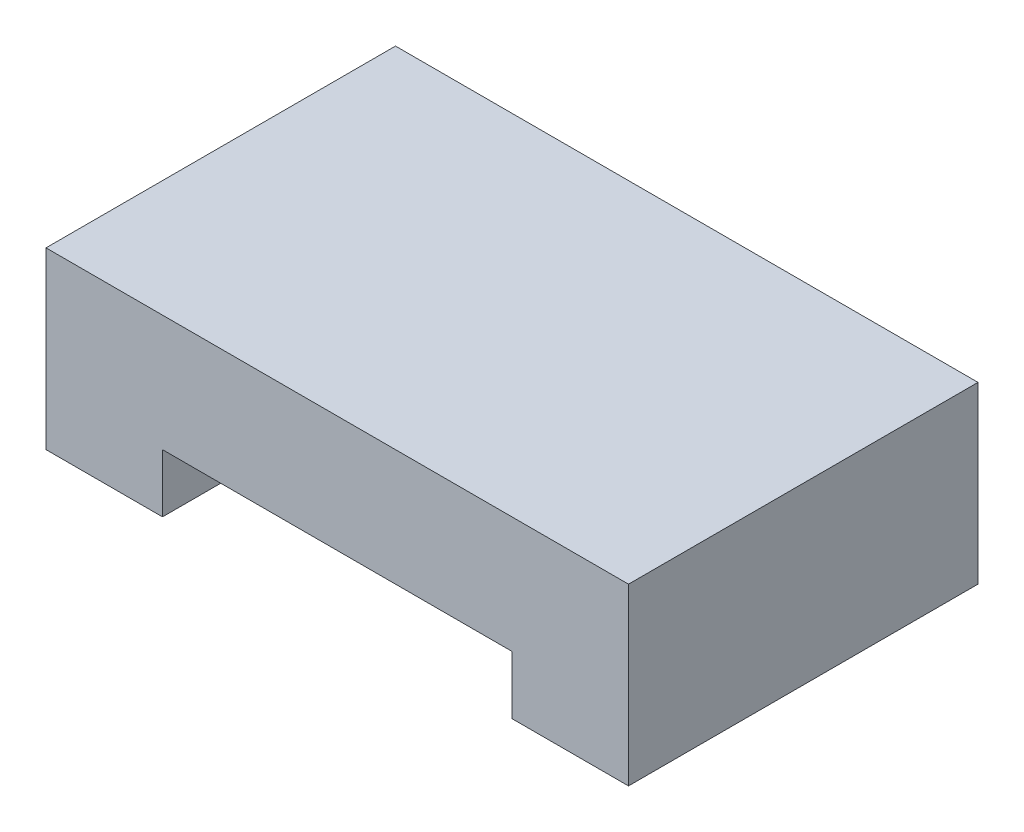
ISO-10303-21;
HEADER;
FILE_DESCRIPTION(('STEP AP214'),'2;1');
FILE_NAME('part.step','',(''),(''),'','','');
FILE_SCHEMA(('AUTOMOTIVE_DESIGN { 1 0 10303 214 1 1 1 1 }'));
ENDSEC;
DATA;
#1=APPLICATION_CONTEXT('core data for automotive mechanical design processes');
#2=APPLICATION_PROTOCOL_DEFINITION('international standard','automotive_design',2000,#1);
#3=PRODUCT_CONTEXT('',#1,'mechanical');
#4=PRODUCT('Part','Part','',(#3));
#5=PRODUCT_RELATED_PRODUCT_CATEGORY('part','',(#4));
#6=PRODUCT_DEFINITION_FORMATION('','',#4);
#7=PRODUCT_DEFINITION_CONTEXT('part definition',#1,'design');
#8=PRODUCT_DEFINITION('design','',#6,#7);
#9=PRODUCT_DEFINITION_SHAPE('','',#8);
#10=(LENGTH_UNIT() NAMED_UNIT(*) SI_UNIT(.MILLI.,.METRE.));
#11=(NAMED_UNIT(*) PLANE_ANGLE_UNIT() SI_UNIT($,.RADIAN.));
#12=(NAMED_UNIT(*) SI_UNIT($,.STERADIAN.) SOLID_ANGLE_UNIT());
#13=UNCERTAINTY_MEASURE_WITH_UNIT(LENGTH_MEASURE(1.E-05),#10,'distance_accuracy_value','');
#14=(GEOMETRIC_REPRESENTATION_CONTEXT(3) GLOBAL_UNCERTAINTY_ASSIGNED_CONTEXT((#13)) GLOBAL_UNIT_ASSIGNED_CONTEXT((#10,
#11,#12)) REPRESENTATION_CONTEXT('',''));
#15=CARTESIAN_POINT('',(0.,0.,0.));
#16=DIRECTION('',(0.,0.,1.));
#17=DIRECTION('',(1.,0.,0.));
#18=AXIS2_PLACEMENT_3D('',#15,#16,#17);
#19=CARTESIAN_POINT('',(0.,0.,0.));
#20=DIRECTION('',(0.,-1.,0.));
#21=DIRECTION('',(0.,0.,-1.));
#22=AXIS2_PLACEMENT_3D('',#19,#20,#21);
#23=PLANE('',#22);
#24=DIRECTION('',(-1.,0.,0.));
#25=VECTOR('',#24,1.);
#26=CARTESIAN_POINT('',(-2.5,0.,-1.5));
#27=LINE('',#26,#25);
#28=CARTESIAN_POINT('',(1.5,0.,-1.5));
#29=VERTEX_POINT('',#28);
#30=CARTESIAN_POINT('',(-1.5,0.,-1.5));
#31=VERTEX_POINT('',#30);
#32=EDGE_CURVE('E171',#29,#31,#27,.T.);
#33=ORIENTED_EDGE('',*,*,#32,.F.);
#34=DIRECTION('',(0.,0.,-1.));
#35=VECTOR('',#34,1.);
#36=CARTESIAN_POINT('',(1.5,0.,1.5));
#37=LINE('',#36,#35);
#38=CARTESIAN_POINT('',(1.5,0.,1.5));
#39=VERTEX_POINT('',#38);
#40=EDGE_CURVE('E112',#39,#29,#37,.T.);
#41=ORIENTED_EDGE('',*,*,#40,.F.);
#42=DIRECTION('',(1.,0.,0.));
#43=VECTOR('',#42,1.);
#44=CARTESIAN_POINT('',(-2.5,0.,1.5));
#45=LINE('',#44,#43);
#46=CARTESIAN_POINT('',(-1.5,0.,1.5));
#47=VERTEX_POINT('',#46);
#48=EDGE_CURVE('E166',#47,#39,#45,.T.);
#49=ORIENTED_EDGE('',*,*,#48,.F.);
#50=DIRECTION('',(0.,0.,1.));
#51=VECTOR('',#50,1.);
#52=CARTESIAN_POINT('',(-1.5,0.,1.5));
#53=LINE('',#52,#51);
#54=EDGE_CURVE('E197',#31,#47,#53,.T.);
#55=ORIENTED_EDGE('',*,*,#54,.F.);
#56=EDGE_LOOP('',(#33,#41,#49,#55));
#57=FACE_BOUND('',#56,.T.);
#58=ADVANCED_FACE('F39',(#57),#23,.T.);
#59=CARTESIAN_POINT('',(2.5,1.,1.5));
#60=DIRECTION('',(-1.,0.,0.));
#61=DIRECTION('',(0.,0.,1.));
#62=AXIS2_PLACEMENT_3D('',#59,#60,#61);
#63=PLANE('',#62);
#64=DIRECTION('',(0.,-1.,0.));
#65=VECTOR('',#64,1.);
#66=CARTESIAN_POINT('',(2.5,1.,1.5));
#67=LINE('',#66,#65);
#68=CARTESIAN_POINT('',(2.5,1.,1.5));
#69=VERTEX_POINT('',#68);
#70=CARTESIAN_POINT('',(2.5,-0.5,1.5));
#71=VERTEX_POINT('',#70);
#72=EDGE_CURVE('E162',#69,#71,#67,.T.);
#73=ORIENTED_EDGE('',*,*,#72,.T.);
#74=DIRECTION('',(0.,0.,-1.));
#75=VECTOR('',#74,1.);
#76=CARTESIAN_POINT('',(2.5,-0.5,1.5));
#77=LINE('',#76,#75);
#78=CARTESIAN_POINT('',(2.5,-0.5,-1.5));
#79=VERTEX_POINT('',#78);
#80=EDGE_CURVE('E130',#71,#79,#77,.T.);
#81=ORIENTED_EDGE('',*,*,#80,.T.);
#82=DIRECTION('',(0.,-1.,0.));
#83=VECTOR('',#82,1.);
#84=CARTESIAN_POINT('',(2.5,1.,-1.5));
#85=LINE('',#84,#83);
#86=CARTESIAN_POINT('',(2.5,1.,-1.5));
#87=VERTEX_POINT('',#86);
#88=EDGE_CURVE('E150',#87,#79,#85,.T.);
#89=ORIENTED_EDGE('',*,*,#88,.F.);
#90=DIRECTION('',(0.,0.,-1.));
#91=VECTOR('',#90,1.);
#92=CARTESIAN_POINT('',(2.5,1.,1.5));
#93=LINE('',#92,#91);
#94=EDGE_CURVE('E170',#69,#87,#93,.T.);
#95=ORIENTED_EDGE('',*,*,#94,.F.);
#96=EDGE_LOOP('',(#73,#81,#89,#95));
#97=FACE_BOUND('',#96,.T.);
#98=ADVANCED_FACE('F289',(#97),#63,.F.);
#99=CARTESIAN_POINT('',(-2.5,1.,-1.5));
#100=DIRECTION('',(0.,0.,1.));
#101=DIRECTION('',(1.,0.,0.));
#102=AXIS2_PLACEMENT_3D('',#99,#100,#101);
#103=PLANE('',#102);
#104=ORIENTED_EDGE('',*,*,#88,.T.);
#105=DIRECTION('',(-1.,0.,0.));
#106=VECTOR('',#105,1.);
#107=CARTESIAN_POINT('',(-2.5,-0.5,-1.5));
#108=LINE('',#107,#106);
#109=CARTESIAN_POINT('',(1.5,-0.5,-1.5));
#110=VERTEX_POINT('',#109);
#111=EDGE_CURVE('E144',#79,#110,#108,.T.);
#112=ORIENTED_EDGE('',*,*,#111,.T.);
#113=DIRECTION('',(0.,1.,0.));
#114=VECTOR('',#113,1.);
#115=CARTESIAN_POINT('',(1.5,-1.,-1.5));
#116=LINE('',#115,#114);
#117=EDGE_CURVE('E205',#110,#29,#116,.T.);
#118=ORIENTED_EDGE('',*,*,#117,.T.);
#119=ORIENTED_EDGE('',*,*,#32,.T.);
#120=DIRECTION('',(0.,1.,0.));
#121=VECTOR('',#120,1.);
#122=CARTESIAN_POINT('',(-1.5,-1.,-1.5));
#123=LINE('',#122,#121);
#124=CARTESIAN_POINT('',(-1.5,-0.5,-1.5));
#125=VERTEX_POINT('',#124);
#126=EDGE_CURVE('E175',#125,#31,#123,.T.);
#127=ORIENTED_EDGE('',*,*,#126,.F.);
#128=DIRECTION('',(-1.,0.,0.));
#129=VECTOR('',#128,1.);
#130=CARTESIAN_POINT('',(-2.5,-0.5,-1.5));
#131=LINE('',#130,#129);
#132=CARTESIAN_POINT('',(-2.5,-0.5,-1.5));
#133=VERTEX_POINT('',#132);
#134=EDGE_CURVE('E90',#125,#133,#131,.T.);
#135=ORIENTED_EDGE('',*,*,#134,.T.);
#136=DIRECTION('',(0.,-1.,0.));
#137=VECTOR('',#136,1.);
#138=CARTESIAN_POINT('',(-2.5,1.,-1.5));
#139=LINE('',#138,#137);
#140=CARTESIAN_POINT('',(-2.5,1.,-1.5));
#141=VERTEX_POINT('',#140);
#142=EDGE_CURVE('E154',#141,#133,#139,.T.);
#143=ORIENTED_EDGE('',*,*,#142,.F.);
#144=DIRECTION('',(-1.,0.,0.));
#145=VECTOR('',#144,1.);
#146=CARTESIAN_POINT('',(-2.5,1.,-1.5));
#147=LINE('',#146,#145);
#148=EDGE_CURVE('E183',#87,#141,#147,.T.);
#149=ORIENTED_EDGE('',*,*,#148,.F.);
#150=EDGE_LOOP('',(#104,#112,#118,#119,#127,#135,#143,#149));
#151=FACE_BOUND('',#150,.T.);
#152=ADVANCED_FACE('F226',(#151),#103,.F.);
#153=CARTESIAN_POINT('',(-2.5,1.,1.5));
#154=DIRECTION('',(1.,0.,0.));
#155=DIRECTION('',(0.,0.,-1.));
#156=AXIS2_PLACEMENT_3D('',#153,#154,#155);
#157=PLANE('',#156);
#158=ORIENTED_EDGE('',*,*,#142,.T.);
#159=DIRECTION('',(0.,0.,1.));
#160=VECTOR('',#159,1.);
#161=CARTESIAN_POINT('',(-2.5,-0.5,1.5));
#162=LINE('',#161,#160);
#163=CARTESIAN_POINT('',(-2.5,-0.5,1.5));
#164=VERTEX_POINT('',#163);
#165=EDGE_CURVE('E11',#133,#164,#162,.T.);
#166=ORIENTED_EDGE('',*,*,#165,.T.);
#167=DIRECTION('',(0.,-1.,0.));
#168=VECTOR('',#167,1.);
#169=CARTESIAN_POINT('',(-2.5,1.,1.5));
#170=LINE('',#169,#168);
#171=CARTESIAN_POINT('',(-2.5,1.,1.5));
#172=VERTEX_POINT('',#171);
#173=EDGE_CURVE('E158',#172,#164,#170,.T.);
#174=ORIENTED_EDGE('',*,*,#173,.F.);
#175=DIRECTION('',(0.,0.,1.));
#176=VECTOR('',#175,1.);
#177=CARTESIAN_POINT('',(-2.5,1.,1.5));
#178=LINE('',#177,#176);
#179=EDGE_CURVE('E179',#141,#172,#178,.T.);
#180=ORIENTED_EDGE('',*,*,#179,.F.);
#181=EDGE_LOOP('',(#158,#166,#174,#180));
#182=FACE_BOUND('',#181,.T.);
#183=ADVANCED_FACE('F241',(#182),#157,.F.);
#184=CARTESIAN_POINT('',(-2.5,1.,1.5));
#185=DIRECTION('',(0.,0.,-1.));
#186=DIRECTION('',(-1.,0.,0.));
#187=AXIS2_PLACEMENT_3D('',#184,#185,#186);
#188=PLANE('',#187);
#189=DIRECTION('',(0.,1.,0.));
#190=VECTOR('',#189,1.);
#191=CARTESIAN_POINT('',(1.5,-1.,1.5));
#192=LINE('',#191,#190);
#193=CARTESIAN_POINT('',(1.5,-0.5,1.5));
#194=VERTEX_POINT('',#193);
#195=EDGE_CURVE('E201',#194,#39,#192,.T.);
#196=ORIENTED_EDGE('',*,*,#195,.F.);
#197=DIRECTION('',(1.,0.,0.));
#198=VECTOR('',#197,1.);
#199=CARTESIAN_POINT('',(-2.5,-0.5,1.5));
#200=LINE('',#199,#198);
#201=EDGE_CURVE('E59',#194,#71,#200,.T.);
#202=ORIENTED_EDGE('',*,*,#201,.T.);
#203=ORIENTED_EDGE('',*,*,#72,.F.);
#204=DIRECTION('',(1.,0.,0.));
#205=VECTOR('',#204,1.);
#206=CARTESIAN_POINT('',(-2.5,1.,1.5));
#207=LINE('',#206,#205);
#208=EDGE_CURVE('E165',#172,#69,#207,.T.);
#209=ORIENTED_EDGE('',*,*,#208,.F.);
#210=ORIENTED_EDGE('',*,*,#173,.T.);
#211=DIRECTION('',(1.,0.,0.));
#212=VECTOR('',#211,1.);
#213=CARTESIAN_POINT('',(-1.5,-0.5,1.5));
#214=LINE('',#213,#212);
#215=CARTESIAN_POINT('',(-1.5,-0.5,1.5));
#216=VERTEX_POINT('',#215);
#217=EDGE_CURVE('E136',#164,#216,#214,.T.);
#218=ORIENTED_EDGE('',*,*,#217,.T.);
#219=DIRECTION('',(0.,1.,0.));
#220=VECTOR('',#219,1.);
#221=CARTESIAN_POINT('',(-1.5,-1.,1.5));
#222=LINE('',#221,#220);
#223=EDGE_CURVE('E193',#216,#47,#222,.T.);
#224=ORIENTED_EDGE('',*,*,#223,.T.);
#225=ORIENTED_EDGE('',*,*,#48,.T.);
#226=EDGE_LOOP('',(#196,#202,#203,#209,#210,#218,#224,#225));
#227=FACE_BOUND('',#226,.T.);
#228=ADVANCED_FACE('F246',(#227),#188,.F.);
#229=CARTESIAN_POINT('',(0.,1.,0.));
#230=DIRECTION('',(0.,-1.,0.));
#231=DIRECTION('',(0.,0.,-1.));
#232=AXIS2_PLACEMENT_3D('',#229,#230,#231);
#233=PLANE('',#232);
#234=ORIENTED_EDGE('',*,*,#94,.T.);
#235=ORIENTED_EDGE('',*,*,#148,.T.);
#236=ORIENTED_EDGE('',*,*,#179,.T.);
#237=ORIENTED_EDGE('',*,*,#208,.T.);
#238=EDGE_LOOP('',(#234,#235,#236,#237));
#239=FACE_BOUND('',#238,.T.);
#240=ADVANCED_FACE('F260',(#239),#233,.F.);
#241=CARTESIAN_POINT('',(-1.5,-1.,1.5));
#242=DIRECTION('',(-1.,0.,0.));
#243=DIRECTION('',(0.,0.,1.));
#244=AXIS2_PLACEMENT_3D('',#241,#242,#243);
#245=PLANE('',#244);
#246=ORIENTED_EDGE('',*,*,#223,.F.);
#247=DIRECTION('',(0.,0.,-1.));
#248=VECTOR('',#247,1.);
#249=CARTESIAN_POINT('',(-1.5,-0.5,-1.5));
#250=LINE('',#249,#248);
#251=EDGE_CURVE('E50',#216,#125,#250,.T.);
#252=ORIENTED_EDGE('',*,*,#251,.T.);
#253=ORIENTED_EDGE('',*,*,#126,.T.);
#254=ORIENTED_EDGE('',*,*,#54,.T.);
#255=EDGE_LOOP('',(#246,#252,#253,#254));
#256=FACE_BOUND('',#255,.T.);
#257=ADVANCED_FACE('F250',(#256),#245,.F.);
#258=CARTESIAN_POINT('',(1.5,-1.,1.5));
#259=DIRECTION('',(1.,0.,0.));
#260=DIRECTION('',(0.,0.,-1.));
#261=AXIS2_PLACEMENT_3D('',#258,#259,#260);
#262=PLANE('',#261);
#263=ORIENTED_EDGE('',*,*,#117,.F.);
#264=DIRECTION('',(0.,0.,1.));
#265=VECTOR('',#264,1.);
#266=CARTESIAN_POINT('',(1.5,-0.5,1.5));
#267=LINE('',#266,#265);
#268=EDGE_CURVE('E140',#110,#194,#267,.T.);
#269=ORIENTED_EDGE('',*,*,#268,.T.);
#270=ORIENTED_EDGE('',*,*,#195,.T.);
#271=ORIENTED_EDGE('',*,*,#40,.T.);
#272=EDGE_LOOP('',(#263,#269,#270,#271));
#273=FACE_BOUND('',#272,.T.);
#274=ADVANCED_FACE('F216',(#273),#262,.F.);
#275=CARTESIAN_POINT('',(0.,-1.,1.));
#276=DIRECTION('',(0.,0.707106781186547,-0.707106781186548));
#277=DIRECTION('',(-1.,0.,0.));
#278=AXIS2_PLACEMENT_3D('',#275,#276,#277);
#279=PLANE('',#278);
#280=DIRECTION('',(-0.577350269189625,-0.577350269189626,-0.577350269189625));
#281=VECTOR('',#280,1.);
#282=CARTESIAN_POINT('',(1.66666666666667,-1.33333333333333,0.666666666666667));
#283=LINE('',#282,#281);
#284=CARTESIAN_POINT('',(2.,-1.,1.));
#285=VERTEX_POINT('',#284);
#286=EDGE_CURVE('E116',#71,#285,#283,.T.);
#287=ORIENTED_EDGE('',*,*,#286,.F.);
#288=ORIENTED_EDGE('',*,*,#201,.F.);
#289=DIRECTION('',(0.577350269189626,-0.577350269189626,-0.577350269189625));
#290=VECTOR('',#289,1.);
#291=CARTESIAN_POINT('',(1.33333333333333,-0.333333333333332,1.66666666666667));
#292=LINE('',#291,#290);
#293=EDGE_CURVE('E108',#285,#194,#292,.F.);
#294=ORIENTED_EDGE('',*,*,#293,.F.);
#295=EDGE_LOOP('',(#287,#288,#294));
#296=FACE_BOUND('',#295,.T.);
#297=ADVANCED_FACE('F278',(#296),#279,.F.);
#298=CARTESIAN_POINT('',(2.,-1.,0.));
#299=DIRECTION('',(0.707106781186548,0.707106781186547,0.));
#300=DIRECTION('',(0.,0.,-1.));
#301=AXIS2_PLACEMENT_3D('',#298,#299,#300);
#302=PLANE('',#301);
#303=DIRECTION('',(0.,0.,-1.));
#304=VECTOR('',#303,1.);
#305=CARTESIAN_POINT('',(2.,-1.,0.));
#306=LINE('',#305,#304);
#307=CARTESIAN_POINT('',(2.,-1.,-1.));
#308=VERTEX_POINT('',#307);
#309=EDGE_CURVE('E113',#285,#308,#306,.T.);
#310=ORIENTED_EDGE('',*,*,#309,.F.);
#311=ORIENTED_EDGE('',*,*,#293,.T.);
#312=ORIENTED_EDGE('',*,*,#268,.F.);
#313=DIRECTION('',(0.577350269189626,-0.577350269189626,0.577350269189625));
#314=VECTOR('',#313,1.);
#315=CARTESIAN_POINT('',(2.33333333333333,-1.33333333333333,-0.666666666666667));
#316=LINE('',#315,#314);
#317=EDGE_CURVE('E120',#308,#110,#316,.F.);
#318=ORIENTED_EDGE('',*,*,#317,.F.);
#319=EDGE_LOOP('',(#310,#311,#312,#318));
#320=FACE_BOUND('',#319,.T.);
#321=ADVANCED_FACE('F276',(#320),#302,.F.);
#322=CARTESIAN_POINT('',(2.,-1.,0.));
#323=DIRECTION('',(-0.707106781186548,0.707106781186547,0.));
#324=DIRECTION('',(0.,0.,1.));
#325=AXIS2_PLACEMENT_3D('',#322,#323,#324);
#326=PLANE('',#325);
#327=ORIENTED_EDGE('',*,*,#286,.T.);
#328=ORIENTED_EDGE('',*,*,#309,.T.);
#329=DIRECTION('',(0.577350269189625,0.577350269189626,-0.577350269189625));
#330=VECTOR('',#329,1.);
#331=CARTESIAN_POINT('',(1.66666666666667,-1.33333333333333,-0.666666666666667));
#332=LINE('',#331,#330);
#333=EDGE_CURVE('E94',#79,#308,#332,.F.);
#334=ORIENTED_EDGE('',*,*,#333,.F.);
#335=ORIENTED_EDGE('',*,*,#80,.F.);
#336=EDGE_LOOP('',(#327,#328,#334,#335));
#337=FACE_BOUND('',#336,.T.);
#338=ADVANCED_FACE('F272',(#337),#326,.F.);
#339=CARTESIAN_POINT('',(0.,-1.,-1.));
#340=DIRECTION('',(0.,0.707106781186547,0.707106781186548));
#341=DIRECTION('',(1.,0.,0.));
#342=AXIS2_PLACEMENT_3D('',#339,#340,#341);
#343=PLANE('',#342);
#344=ORIENTED_EDGE('',*,*,#317,.T.);
#345=ORIENTED_EDGE('',*,*,#111,.F.);
#346=ORIENTED_EDGE('',*,*,#333,.T.);
#347=EDGE_LOOP('',(#344,#345,#346));
#348=FACE_BOUND('',#347,.T.);
#349=ADVANCED_FACE('F267',(#348),#343,.F.);
#350=CARTESIAN_POINT('',(0.,-1.,-1.));
#351=DIRECTION('',(0.,-0.707106781186547,-0.707106781186548));
#352=DIRECTION('',(-1.,0.,0.));
#353=AXIS2_PLACEMENT_3D('',#350,#351,#352);
#354=PLANE('',#353);
#355=DIRECTION('',(0.577350269189625,-0.577350269189626,0.577350269189625));
#356=VECTOR('',#355,1.);
#357=CARTESIAN_POINT('',(-1.66666666666667,-1.33333333333333,-0.666666666666667));
#358=LINE('',#357,#356);
#359=CARTESIAN_POINT('',(-2.,-1.,-1.));
#360=VERTEX_POINT('',#359);
#361=EDGE_CURVE('E86',#133,#360,#358,.T.);
#362=ORIENTED_EDGE('',*,*,#361,.F.);
#363=ORIENTED_EDGE('',*,*,#134,.F.);
#364=DIRECTION('',(-0.577350269189625,-0.577350269189626,0.577350269189625));
#365=VECTOR('',#364,1.);
#366=CARTESIAN_POINT('',(-1.33333333333333,-0.333333333333333,-1.66666666666667));
#367=LINE('',#366,#365);
#368=EDGE_CURVE('E43',#360,#125,#367,.F.);
#369=ORIENTED_EDGE('',*,*,#368,.F.);
#370=EDGE_LOOP('',(#362,#363,#369));
#371=FACE_BOUND('',#370,.T.);
#372=ADVANCED_FACE('F41',(#371),#354,.T.);
#373=CARTESIAN_POINT('',(-2.,-1.,0.));
#374=DIRECTION('',(0.707106781186548,-0.707106781186547,0.));
#375=DIRECTION('',(0.,0.,-1.));
#376=AXIS2_PLACEMENT_3D('',#373,#374,#375);
#377=PLANE('',#376);
#378=DIRECTION('',(0.,0.,1.));
#379=VECTOR('',#378,1.);
#380=CARTESIAN_POINT('',(-2.,-1.,1.5));
#381=LINE('',#380,#379);
#382=CARTESIAN_POINT('',(-2.,-1.,1.));
#383=VERTEX_POINT('',#382);
#384=EDGE_CURVE('E78',#360,#383,#381,.T.);
#385=ORIENTED_EDGE('',*,*,#384,.F.);
#386=ORIENTED_EDGE('',*,*,#368,.T.);
#387=ORIENTED_EDGE('',*,*,#251,.F.);
#388=DIRECTION('',(-0.577350269189625,-0.577350269189626,-0.577350269189625));
#389=VECTOR('',#388,1.);
#390=CARTESIAN_POINT('',(-2.33333333333333,-1.33333333333333,0.666666666666667));
#391=LINE('',#390,#389);
#392=EDGE_CURVE('E96',#383,#216,#391,.F.);
#393=ORIENTED_EDGE('',*,*,#392,.F.);
#394=EDGE_LOOP('',(#385,#386,#387,#393));
#395=FACE_BOUND('',#394,.T.);
#396=ADVANCED_FACE('F95',(#395),#377,.T.);
#397=CARTESIAN_POINT('',(-2.,-1.,0.));
#398=DIRECTION('',(-0.707106781186548,-0.707106781186547,0.));
#399=DIRECTION('',(0.,0.,1.));
#400=AXIS2_PLACEMENT_3D('',#397,#398,#399);
#401=PLANE('',#400);
#402=ORIENTED_EDGE('',*,*,#361,.T.);
#403=ORIENTED_EDGE('',*,*,#384,.T.);
#404=DIRECTION('',(-0.577350269189625,0.577350269189626,0.577350269189625));
#405=VECTOR('',#404,1.);
#406=CARTESIAN_POINT('',(-1.66666666666667,-1.33333333333333,0.666666666666667));
#407=LINE('',#406,#405);
#408=EDGE_CURVE('E103',#164,#383,#407,.F.);
#409=ORIENTED_EDGE('',*,*,#408,.F.);
#410=ORIENTED_EDGE('',*,*,#165,.F.);
#411=EDGE_LOOP('',(#402,#403,#409,#410));
#412=FACE_BOUND('',#411,.T.);
#413=ADVANCED_FACE('F99',(#412),#401,.T.);
#414=CARTESIAN_POINT('',(0.,-1.,1.));
#415=DIRECTION('',(0.,-0.707106781186547,0.707106781186548));
#416=DIRECTION('',(1.,0.,0.));
#417=AXIS2_PLACEMENT_3D('',#414,#415,#416);
#418=PLANE('',#417);
#419=ORIENTED_EDGE('',*,*,#392,.T.);
#420=ORIENTED_EDGE('',*,*,#217,.F.);
#421=ORIENTED_EDGE('',*,*,#408,.T.);
#422=EDGE_LOOP('',(#419,#420,#421));
#423=FACE_BOUND('',#422,.T.);
#424=ADVANCED_FACE('F249',(#423),#418,.T.);
#425=CLOSED_SHELL('',(#58,#98,#152,#183,#228,#240,#257,#274,#297,#321,#338,#349,#372,#396,#413,#424));
#426=MANIFOLD_SOLID_BREP('B2',#425);
#427=ADVANCED_BREP_SHAPE_REPRESENTATION('',(#18,#426),#14);
#428=SHAPE_DEFINITION_REPRESENTATION(#9,#427);
ENDSEC;
END-ISO-10303-21;
